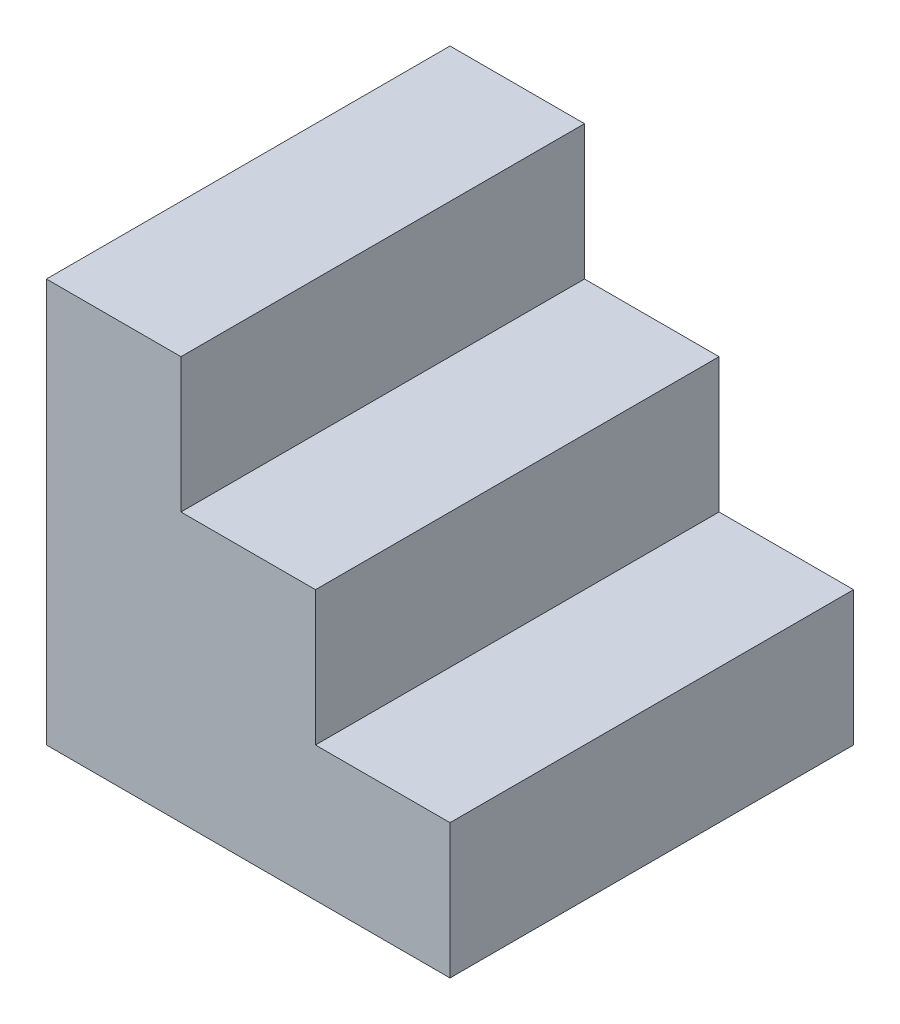
ISO-10303-21;
HEADER;
FILE_DESCRIPTION(('STEP AP214'),'2;1');
FILE_NAME('part.step','',(''),(''),'','','');
FILE_SCHEMA(('AUTOMOTIVE_DESIGN { 1 0 10303 214 1 1 1 1 }'));
ENDSEC;
DATA;
#1=APPLICATION_CONTEXT('core data for automotive mechanical design processes');
#2=APPLICATION_PROTOCOL_DEFINITION('international standard','automotive_design',2000,#1);
#3=PRODUCT_CONTEXT('',#1,'mechanical');
#4=PRODUCT('Part','Part','',(#3));
#5=PRODUCT_RELATED_PRODUCT_CATEGORY('part','',(#4));
#6=PRODUCT_DEFINITION_FORMATION('','',#4);
#7=PRODUCT_DEFINITION_CONTEXT('part definition',#1,'design');
#8=PRODUCT_DEFINITION('design','',#6,#7);
#9=PRODUCT_DEFINITION_SHAPE('','',#8);
#10=(LENGTH_UNIT() NAMED_UNIT(*) SI_UNIT(.MILLI.,.METRE.));
#11=(NAMED_UNIT(*) PLANE_ANGLE_UNIT() SI_UNIT($,.RADIAN.));
#12=(NAMED_UNIT(*) SI_UNIT($,.STERADIAN.) SOLID_ANGLE_UNIT());
#13=UNCERTAINTY_MEASURE_WITH_UNIT(LENGTH_MEASURE(1.E-05),#10,'distance_accuracy_value','');
#14=(GEOMETRIC_REPRESENTATION_CONTEXT(3) GLOBAL_UNCERTAINTY_ASSIGNED_CONTEXT((#13)) GLOBAL_UNIT_ASSIGNED_CONTEXT((#10,
#11,#12)) REPRESENTATION_CONTEXT('',''));
#15=CARTESIAN_POINT('',(0.,0.,0.));
#16=DIRECTION('',(0.,0.,1.));
#17=DIRECTION('',(1.,0.,0.));
#18=AXIS2_PLACEMENT_3D('',#15,#16,#17);
#19=CARTESIAN_POINT('',(50.,100.,100.));
#20=DIRECTION('',(0.,-1.,0.));
#21=DIRECTION('',(0.,0.,-1.));
#22=AXIS2_PLACEMENT_3D('',#19,#20,#21);
#23=PLANE('',#22);
#24=DIRECTION('',(-1.,0.,0.));
#25=VECTOR('',#24,1.);
#26=CARTESIAN_POINT('',(50.,100.,0.));
#27=LINE('',#26,#25);
#28=CARTESIAN_POINT('',(33.3333333333333,100.,0.));
#29=VERTEX_POINT('',#28);
#30=CARTESIAN_POINT('',(0.,100.,0.));
#31=VERTEX_POINT('',#30);
#32=EDGE_CURVE('E138',#29,#31,#27,.T.);
#33=ORIENTED_EDGE('',*,*,#32,.T.);
#34=DIRECTION('',(0.,0.,-1.));
#35=VECTOR('',#34,1.);
#36=CARTESIAN_POINT('',(0.,100.,100.));
#37=LINE('',#36,#35);
#38=CARTESIAN_POINT('',(0.,100.,100.));
#39=VERTEX_POINT('',#38);
#40=EDGE_CURVE('E11',#39,#31,#37,.T.);
#41=ORIENTED_EDGE('',*,*,#40,.F.);
#42=DIRECTION('',(-1.,0.,0.));
#43=VECTOR('',#42,1.);
#44=CARTESIAN_POINT('',(50.,100.,100.));
#45=LINE('',#44,#43);
#46=CARTESIAN_POINT('',(33.3333333333333,100.,100.));
#47=VERTEX_POINT('',#46);
#48=EDGE_CURVE('E160',#47,#39,#45,.T.);
#49=ORIENTED_EDGE('',*,*,#48,.F.);
#50=DIRECTION('',(0.,0.,-1.));
#51=VECTOR('',#50,1.);
#52=CARTESIAN_POINT('',(33.3333333333333,100.,100.));
#53=LINE('',#52,#51);
#54=EDGE_CURVE('E134',#47,#29,#53,.T.);
#55=ORIENTED_EDGE('',*,*,#54,.T.);
#56=EDGE_LOOP('',(#33,#41,#49,#55));
#57=FACE_BOUND('',#56,.T.);
#58=ADVANCED_FACE('F37',(#57),#23,.F.);
#59=CARTESIAN_POINT('',(0.,-60.1414213562373,100.));
#60=DIRECTION('',(1.,0.,0.));
#61=DIRECTION('',(0.,1.,0.));
#62=AXIS2_PLACEMENT_3D('',#59,#60,#61);
#63=PLANE('',#62);
#64=DIRECTION('',(0.,-1.,0.));
#65=VECTOR('',#64,1.);
#66=CARTESIAN_POINT('',(0.,-60.1414213562373,0.));
#67=LINE('',#66,#65);
#68=CARTESIAN_POINT('',(0.,0.,0.));
#69=VERTEX_POINT('',#68);
#70=EDGE_CURVE('E142',#31,#69,#67,.T.);
#71=ORIENTED_EDGE('',*,*,#70,.T.);
#72=DIRECTION('',(0.,0.,-1.));
#73=VECTOR('',#72,1.);
#74=CARTESIAN_POINT('',(0.,0.,100.));
#75=LINE('',#74,#73);
#76=CARTESIAN_POINT('',(0.,0.,100.));
#77=VERTEX_POINT('',#76);
#78=EDGE_CURVE('E46',#77,#69,#75,.T.);
#79=ORIENTED_EDGE('',*,*,#78,.F.);
#80=DIRECTION('',(0.,-1.,0.));
#81=VECTOR('',#80,1.);
#82=CARTESIAN_POINT('',(0.,-60.1414213562373,100.));
#83=LINE('',#82,#81);
#84=EDGE_CURVE('E97',#39,#77,#83,.T.);
#85=ORIENTED_EDGE('',*,*,#84,.F.);
#86=ORIENTED_EDGE('',*,*,#40,.T.);
#87=EDGE_LOOP('',(#71,#79,#85,#86));
#88=FACE_BOUND('',#87,.T.);
#89=ADVANCED_FACE('F206',(#88),#63,.F.);
#90=CARTESIAN_POINT('',(50.,0.,100.));
#91=DIRECTION('',(0.,1.,0.));
#92=DIRECTION('',(0.,0.,1.));
#93=AXIS2_PLACEMENT_3D('',#90,#91,#92);
#94=PLANE('',#93);
#95=DIRECTION('',(1.,0.,0.));
#96=VECTOR('',#95,1.);
#97=CARTESIAN_POINT('',(50.,0.,0.));
#98=LINE('',#97,#96);
#99=CARTESIAN_POINT('',(100.,0.,0.));
#100=VERTEX_POINT('',#99);
#101=EDGE_CURVE('E145',#69,#100,#98,.T.);
#102=ORIENTED_EDGE('',*,*,#101,.T.);
#103=DIRECTION('',(0.,0.,-1.));
#104=VECTOR('',#103,1.);
#105=CARTESIAN_POINT('',(100.,0.,100.));
#106=LINE('',#105,#104);
#107=CARTESIAN_POINT('',(100.,0.,100.));
#108=VERTEX_POINT('',#107);
#109=EDGE_CURVE('E171',#108,#100,#106,.T.);
#110=ORIENTED_EDGE('',*,*,#109,.F.);
#111=DIRECTION('',(1.,0.,0.));
#112=VECTOR('',#111,1.);
#113=CARTESIAN_POINT('',(50.,0.,100.));
#114=LINE('',#113,#112);
#115=EDGE_CURVE('E181',#77,#108,#114,.T.);
#116=ORIENTED_EDGE('',*,*,#115,.F.);
#117=ORIENTED_EDGE('',*,*,#78,.T.);
#118=EDGE_LOOP('',(#102,#110,#116,#117));
#119=FACE_BOUND('',#118,.T.);
#120=ADVANCED_FACE('F179',(#119),#94,.F.);
#121=CARTESIAN_POINT('',(100.,-60.1414213562373,100.));
#122=DIRECTION('',(-1.,0.,0.));
#123=DIRECTION('',(0.,0.,1.));
#124=AXIS2_PLACEMENT_3D('',#121,#122,#123);
#125=PLANE('',#124);
#126=DIRECTION('',(0.,1.,0.));
#127=VECTOR('',#126,1.);
#128=CARTESIAN_POINT('',(100.,-60.1414213562373,0.));
#129=LINE('',#128,#127);
#130=CARTESIAN_POINT('',(100.,33.3333333333333,0.));
#131=VERTEX_POINT('',#130);
#132=EDGE_CURVE('E148',#100,#131,#129,.T.);
#133=ORIENTED_EDGE('',*,*,#132,.T.);
#134=DIRECTION('',(0.,0.,-1.));
#135=VECTOR('',#134,1.);
#136=CARTESIAN_POINT('',(100.,33.3333333333333,100.));
#137=LINE('',#136,#135);
#138=CARTESIAN_POINT('',(100.,33.3333333333333,100.));
#139=VERTEX_POINT('',#138);
#140=EDGE_CURVE('E167',#139,#131,#137,.T.);
#141=ORIENTED_EDGE('',*,*,#140,.F.);
#142=DIRECTION('',(0.,1.,0.));
#143=VECTOR('',#142,1.);
#144=CARTESIAN_POINT('',(100.,-60.1414213562373,100.));
#145=LINE('',#144,#143);
#146=EDGE_CURVE('E194',#108,#139,#145,.T.);
#147=ORIENTED_EDGE('',*,*,#146,.F.);
#148=ORIENTED_EDGE('',*,*,#109,.T.);
#149=EDGE_LOOP('',(#133,#141,#147,#148));
#150=FACE_BOUND('',#149,.T.);
#151=ADVANCED_FACE('F189',(#150),#125,.F.);
#152=CARTESIAN_POINT('',(50.,33.3333333333333,100.));
#153=DIRECTION('',(0.,-1.,0.));
#154=DIRECTION('',(0.,0.,-1.));
#155=AXIS2_PLACEMENT_3D('',#152,#153,#154);
#156=PLANE('',#155);
#157=DIRECTION('',(-1.,0.,0.));
#158=VECTOR('',#157,1.);
#159=CARTESIAN_POINT('',(50.,33.3333333333333,0.));
#160=LINE('',#159,#158);
#161=CARTESIAN_POINT('',(66.6666666666667,33.3333333333333,0.));
#162=VERTEX_POINT('',#161);
#163=EDGE_CURVE('E151',#131,#162,#160,.T.);
#164=ORIENTED_EDGE('',*,*,#163,.T.);
#165=DIRECTION('',(0.,0.,-1.));
#166=VECTOR('',#165,1.);
#167=CARTESIAN_POINT('',(66.6666666666667,33.3333333333333,100.));
#168=LINE('',#167,#166);
#169=CARTESIAN_POINT('',(66.6666666666667,33.3333333333333,100.));
#170=VERTEX_POINT('',#169);
#171=EDGE_CURVE('E127',#170,#162,#168,.T.);
#172=ORIENTED_EDGE('',*,*,#171,.F.);
#173=DIRECTION('',(-1.,0.,0.));
#174=VECTOR('',#173,1.);
#175=CARTESIAN_POINT('',(50.,33.3333333333333,100.));
#176=LINE('',#175,#174);
#177=EDGE_CURVE('E116',#139,#170,#176,.T.);
#178=ORIENTED_EDGE('',*,*,#177,.F.);
#179=ORIENTED_EDGE('',*,*,#140,.T.);
#180=EDGE_LOOP('',(#164,#172,#178,#179));
#181=FACE_BOUND('',#180,.T.);
#182=ADVANCED_FACE('F192',(#181),#156,.F.);
#183=CARTESIAN_POINT('',(66.6666666666667,-60.1414213562373,100.));
#184=DIRECTION('',(-1.,0.,0.));
#185=DIRECTION('',(0.,-1.,0.));
#186=AXIS2_PLACEMENT_3D('',#183,#184,#185);
#187=PLANE('',#186);
#188=DIRECTION('',(0.,1.,0.));
#189=VECTOR('',#188,1.);
#190=CARTESIAN_POINT('',(66.6666666666667,-60.1414213562373,0.));
#191=LINE('',#190,#189);
#192=CARTESIAN_POINT('',(66.6666666666667,66.6666666666667,0.));
#193=VERTEX_POINT('',#192);
#194=EDGE_CURVE('E125',#162,#193,#191,.T.);
#195=ORIENTED_EDGE('',*,*,#194,.T.);
#196=DIRECTION('',(0.,0.,-1.));
#197=VECTOR('',#196,1.);
#198=CARTESIAN_POINT('',(66.6666666666667,66.6666666666667,100.));
#199=LINE('',#198,#197);
#200=CARTESIAN_POINT('',(66.6666666666667,66.6666666666667,100.));
#201=VERTEX_POINT('',#200);
#202=EDGE_CURVE('E122',#201,#193,#199,.T.);
#203=ORIENTED_EDGE('',*,*,#202,.F.);
#204=DIRECTION('',(0.,1.,0.));
#205=VECTOR('',#204,1.);
#206=CARTESIAN_POINT('',(66.6666666666667,-60.1414213562373,100.));
#207=LINE('',#206,#205);
#208=EDGE_CURVE('E110',#170,#201,#207,.T.);
#209=ORIENTED_EDGE('',*,*,#208,.F.);
#210=ORIENTED_EDGE('',*,*,#171,.T.);
#211=EDGE_LOOP('',(#195,#203,#209,#210));
#212=FACE_BOUND('',#211,.T.);
#213=ADVANCED_FACE('F123',(#212),#187,.F.);
#214=CARTESIAN_POINT('',(50.,66.6666666666667,100.));
#215=DIRECTION('',(0.,-1.,0.));
#216=DIRECTION('',(0.,0.,-1.));
#217=AXIS2_PLACEMENT_3D('',#214,#215,#216);
#218=PLANE('',#217);
#219=DIRECTION('',(-1.,0.,0.));
#220=VECTOR('',#219,1.);
#221=CARTESIAN_POINT('',(50.,66.6666666666667,0.));
#222=LINE('',#221,#220);
#223=CARTESIAN_POINT('',(33.3333333333333,66.6666666666667,0.));
#224=VERTEX_POINT('',#223);
#225=EDGE_CURVE('E83',#193,#224,#222,.T.);
#226=ORIENTED_EDGE('',*,*,#225,.T.);
#227=DIRECTION('',(0.,0.,-1.));
#228=VECTOR('',#227,1.);
#229=CARTESIAN_POINT('',(33.3333333333333,66.6666666666667,100.));
#230=LINE('',#229,#228);
#231=CARTESIAN_POINT('',(33.3333333333333,66.6666666666667,100.));
#232=VERTEX_POINT('',#231);
#233=EDGE_CURVE('E128',#232,#224,#230,.T.);
#234=ORIENTED_EDGE('',*,*,#233,.F.);
#235=DIRECTION('',(-1.,0.,0.));
#236=VECTOR('',#235,1.);
#237=CARTESIAN_POINT('',(50.,66.6666666666667,100.));
#238=LINE('',#237,#236);
#239=EDGE_CURVE('E114',#201,#232,#238,.T.);
#240=ORIENTED_EDGE('',*,*,#239,.F.);
#241=ORIENTED_EDGE('',*,*,#202,.T.);
#242=EDGE_LOOP('',(#226,#234,#240,#241));
#243=FACE_BOUND('',#242,.T.);
#244=ADVANCED_FACE('F130',(#243),#218,.F.);
#245=CARTESIAN_POINT('',(33.3333333333333,-60.1414213562373,100.));
#246=DIRECTION('',(-1.,0.,0.));
#247=DIRECTION('',(0.,-1.,0.));
#248=AXIS2_PLACEMENT_3D('',#245,#246,#247);
#249=PLANE('',#248);
#250=DIRECTION('',(0.,1.,0.));
#251=VECTOR('',#250,1.);
#252=CARTESIAN_POINT('',(33.3333333333333,-60.1414213562373,0.));
#253=LINE('',#252,#251);
#254=EDGE_CURVE('E89',#224,#29,#253,.T.);
#255=ORIENTED_EDGE('',*,*,#254,.T.);
#256=ORIENTED_EDGE('',*,*,#54,.F.);
#257=DIRECTION('',(0.,1.,0.));
#258=VECTOR('',#257,1.);
#259=CARTESIAN_POINT('',(33.3333333333333,-60.1414213562373,100.));
#260=LINE('',#259,#258);
#261=EDGE_CURVE('E54',#232,#47,#260,.T.);
#262=ORIENTED_EDGE('',*,*,#261,.F.);
#263=ORIENTED_EDGE('',*,*,#233,.T.);
#264=EDGE_LOOP('',(#255,#256,#262,#263));
#265=FACE_BOUND('',#264,.T.);
#266=ADVANCED_FACE('F222',(#265),#249,.F.);
#267=CARTESIAN_POINT('',(50.,-60.1414213562373,100.));
#268=DIRECTION('',(0.,0.,1.));
#269=DIRECTION('',(1.,0.,0.));
#270=AXIS2_PLACEMENT_3D('',#267,#268,#269);
#271=PLANE('',#270);
#272=ORIENTED_EDGE('',*,*,#48,.T.);
#273=ORIENTED_EDGE('',*,*,#84,.T.);
#274=ORIENTED_EDGE('',*,*,#115,.T.);
#275=ORIENTED_EDGE('',*,*,#146,.T.);
#276=ORIENTED_EDGE('',*,*,#177,.T.);
#277=ORIENTED_EDGE('',*,*,#208,.T.);
#278=ORIENTED_EDGE('',*,*,#239,.T.);
#279=ORIENTED_EDGE('',*,*,#261,.T.);
#280=EDGE_LOOP('',(#272,#273,#274,#275,#276,#277,#278,#279));
#281=FACE_BOUND('',#280,.T.);
#282=ADVANCED_FACE('F112',(#281),#271,.T.);
#283=CARTESIAN_POINT('',(50.,-60.1414213562373,0.));
#284=DIRECTION('',(0.,0.,1.));
#285=DIRECTION('',(1.,0.,0.));
#286=AXIS2_PLACEMENT_3D('',#283,#284,#285);
#287=PLANE('',#286);
#288=ORIENTED_EDGE('',*,*,#32,.F.);
#289=ORIENTED_EDGE('',*,*,#254,.F.);
#290=ORIENTED_EDGE('',*,*,#225,.F.);
#291=ORIENTED_EDGE('',*,*,#194,.F.);
#292=ORIENTED_EDGE('',*,*,#163,.F.);
#293=ORIENTED_EDGE('',*,*,#132,.F.);
#294=ORIENTED_EDGE('',*,*,#101,.F.);
#295=ORIENTED_EDGE('',*,*,#70,.F.);
#296=EDGE_LOOP('',(#288,#289,#290,#291,#292,#293,#294,#295));
#297=FACE_BOUND('',#296,.T.);
#298=ADVANCED_FACE('F185',(#297),#287,.F.);
#299=CLOSED_SHELL('',(#58,#89,#120,#151,#182,#213,#244,#266,#282,#298));
#300=MANIFOLD_SOLID_BREP('B2',#299);
#301=ADVANCED_BREP_SHAPE_REPRESENTATION('',(#18,#300),#14);
#302=SHAPE_DEFINITION_REPRESENTATION(#9,#301);
ENDSEC;
END-ISO-10303-21;
